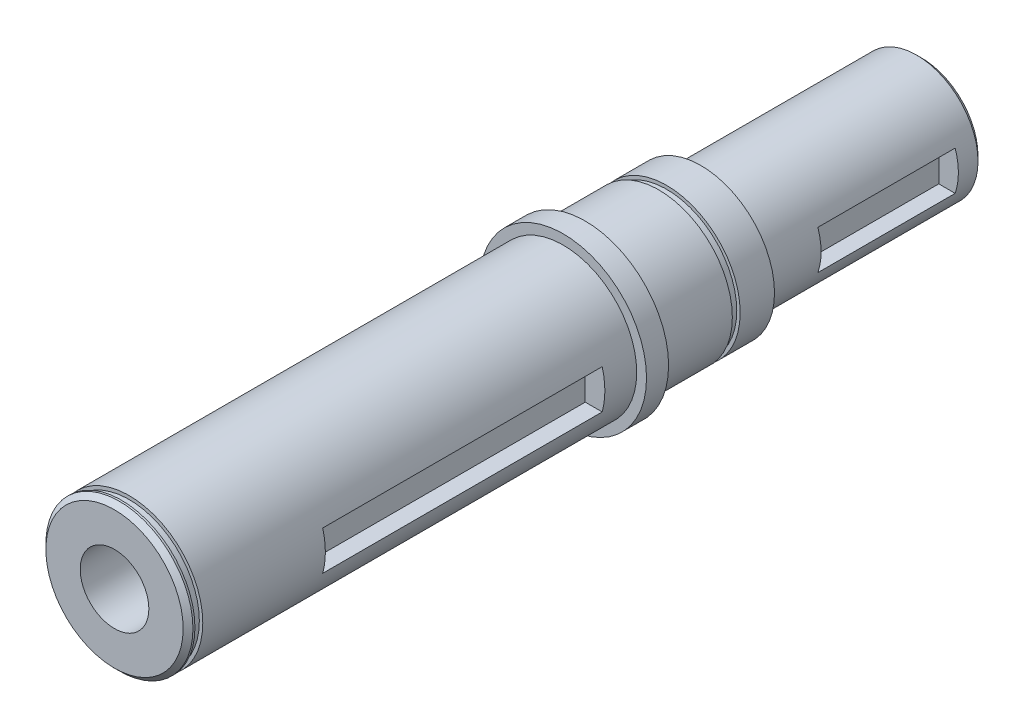
ISO-10303-21;
HEADER;
FILE_DESCRIPTION(('STEP AP214'),'2;1');
FILE_NAME('part.step','',(''),(''),'','','');
FILE_SCHEMA(('AUTOMOTIVE_DESIGN { 1 0 10303 214 1 1 1 1 }'));
ENDSEC;
DATA;
#1=APPLICATION_CONTEXT('core data for automotive mechanical design processes');
#2=APPLICATION_PROTOCOL_DEFINITION('international standard','automotive_design',2000,#1);
#3=PRODUCT_CONTEXT('',#1,'mechanical');
#4=PRODUCT('Part','Part','',(#3));
#5=PRODUCT_RELATED_PRODUCT_CATEGORY('part','',(#4));
#6=PRODUCT_DEFINITION_FORMATION('','',#4);
#7=PRODUCT_DEFINITION_CONTEXT('part definition',#1,'design');
#8=PRODUCT_DEFINITION('design','',#6,#7);
#9=PRODUCT_DEFINITION_SHAPE('','',#8);
#10=(LENGTH_UNIT() NAMED_UNIT(*) SI_UNIT(.MILLI.,.METRE.));
#11=(NAMED_UNIT(*) PLANE_ANGLE_UNIT() SI_UNIT($,.RADIAN.));
#12=(NAMED_UNIT(*) SI_UNIT($,.STERADIAN.) SOLID_ANGLE_UNIT());
#13=UNCERTAINTY_MEASURE_WITH_UNIT(LENGTH_MEASURE(1.E-05),#10,'distance_accuracy_value','');
#14=(GEOMETRIC_REPRESENTATION_CONTEXT(3) GLOBAL_UNCERTAINTY_ASSIGNED_CONTEXT((#13)) GLOBAL_UNIT_ASSIGNED_CONTEXT((#10,
#11,#12)) REPRESENTATION_CONTEXT('',''));
#15=CARTESIAN_POINT('',(0.,0.,0.));
#16=DIRECTION('',(0.,0.,1.));
#17=DIRECTION('',(1.,0.,0.));
#18=AXIS2_PLACEMENT_3D('',#15,#16,#17);
#19=CARTESIAN_POINT('',(0.,0.,-45.));
#20=DIRECTION('',(0.,0.,1.));
#21=DIRECTION('',(1.,0.,0.));
#22=AXIS2_PLACEMENT_3D('',#19,#20,#21);
#23=PLANE('',#22);
#24=CARTESIAN_POINT('',(0.,0.,-45.));
#25=DIRECTION('',(0.,0.,1.));
#26=DIRECTION('',(1.,0.,0.));
#27=AXIS2_PLACEMENT_3D('',#24,#25,#26);
#28=CIRCLE('',#27,7.);
#29=CARTESIAN_POINT('',(7.,0.,-45.));
#30=VERTEX_POINT('',#29);
#31=EDGE_CURVE('E9',#30,#30,#28,.T.);
#32=ORIENTED_EDGE('',*,*,#31,.T.);
#33=EDGE_LOOP('',(#32));
#34=FACE_BOUND('',#33,.T.);
#35=ADVANCED_FACE('F15',(#34),#23,.T.);
#36=CARTESIAN_POINT('',(0.,0.,-45.));
#37=DIRECTION('',(0.,0.,1.));
#38=DIRECTION('',(1.,0.,0.));
#39=AXIS2_PLACEMENT_3D('',#36,#37,#38);
#40=CYLINDRICAL_SURFACE('',#39,7.);
#41=DIRECTION('',(0.,0.,1.));
#42=VECTOR('',#41,1.);
#43=CARTESIAN_POINT('',(7.,0.,-45.));
#44=LINE('',#43,#42);
#45=CARTESIAN_POINT('',(7.,0.,56.5));
#46=VERTEX_POINT('',#45);
#47=EDGE_CURVE('E24',#30,#46,#44,.T.);
#48=ORIENTED_EDGE('',*,*,#47,.F.);
#49=ORIENTED_EDGE('',*,*,#31,.F.);
#50=ORIENTED_EDGE('',*,*,#47,.T.);
#51=CARTESIAN_POINT('',(0.,0.,56.5));
#52=DIRECTION('',(0.,0.,1.));
#53=DIRECTION('',(1.,0.,0.));
#54=AXIS2_PLACEMENT_3D('',#51,#52,#53);
#55=CIRCLE('',#54,7.);
#56=EDGE_CURVE('E356',#46,#46,#55,.T.);
#57=ORIENTED_EDGE('',*,*,#56,.T.);
#58=EDGE_LOOP('',(#48,#49,#50,#57));
#59=FACE_BOUND('',#58,.T.);
#60=ADVANCED_FACE('F414',(#59),#40,.F.);
#61=CARTESIAN_POINT('',(0.,0.,56.5));
#62=DIRECTION('',(0.,0.,1.));
#63=DIRECTION('',(1.,0.,0.));
#64=AXIS2_PLACEMENT_3D('',#61,#62,#63);
#65=PLANE('',#64);
#66=ORIENTED_EDGE('',*,*,#56,.F.);
#67=EDGE_LOOP('',(#66));
#68=FACE_BOUND('',#67,.T.);
#69=CARTESIAN_POINT('',(0.,0.,56.5));
#70=DIRECTION('',(0.,0.,1.));
#71=DIRECTION('',(1.,0.,0.));
#72=AXIS2_PLACEMENT_3D('',#69,#70,#71);
#73=CIRCLE('',#72,14.);
#74=CARTESIAN_POINT('',(14.,0.,56.5));
#75=VERTEX_POINT('',#74);
#76=EDGE_CURVE('E361',#75,#75,#73,.T.);
#77=ORIENTED_EDGE('',*,*,#76,.T.);
#78=EDGE_LOOP('',(#77));
#79=FACE_BOUND('',#78,.T.);
#80=ADVANCED_FACE('F418',(#68,#79),#65,.T.);
#81=CARTESIAN_POINT('',(0.,0.,55.5));
#82=DIRECTION('',(0.,0.,-1.));
#83=DIRECTION('',(1.,0.,0.));
#84=AXIS2_PLACEMENT_3D('',#81,#82,#83);
#85=CONICAL_SURFACE('',#84,15.,0.785398163397);
#86=CARTESIAN_POINT('',(0.,0.,55.5));
#87=DIRECTION('',(0.,0.,1.));
#88=DIRECTION('',(1.,0.,0.));
#89=AXIS2_PLACEMENT_3D('',#86,#87,#88);
#90=CIRCLE('',#89,15.);
#91=CARTESIAN_POINT('',(15.,0.,55.5));
#92=VERTEX_POINT('',#91);
#93=EDGE_CURVE('E314',#92,#92,#90,.T.);
#94=ORIENTED_EDGE('',*,*,#93,.T.);
#95=DIRECTION('',(-0.707106781186548,0.,0.707106781186548));
#96=VECTOR('',#95,1.);
#97=CARTESIAN_POINT('',(15.,0.,55.5));
#98=LINE('',#97,#96);
#99=EDGE_CURVE('E140',#92,#75,#98,.T.);
#100=ORIENTED_EDGE('',*,*,#99,.T.);
#101=ORIENTED_EDGE('',*,*,#76,.F.);
#102=ORIENTED_EDGE('',*,*,#99,.F.);
#103=EDGE_LOOP('',(#94,#100,#101,#102));
#104=FACE_BOUND('',#103,.T.);
#105=ADVANCED_FACE('F420',(#104),#85,.T.);
#106=CARTESIAN_POINT('',(0.,0.,55.1));
#107=DIRECTION('',(0.,0.,1.));
#108=DIRECTION('',(1.,0.,0.));
#109=AXIS2_PLACEMENT_3D('',#106,#107,#108);
#110=CYLINDRICAL_SURFACE('',#109,15.);
#111=CARTESIAN_POINT('',(0.,0.,55.1));
#112=DIRECTION('',(0.,0.,1.));
#113=DIRECTION('',(1.,0.,0.));
#114=AXIS2_PLACEMENT_3D('',#111,#112,#113);
#115=CIRCLE('',#114,15.);
#116=CARTESIAN_POINT('',(15.,0.,55.1));
#117=VERTEX_POINT('',#116);
#118=EDGE_CURVE('E312',#117,#117,#115,.T.);
#119=ORIENTED_EDGE('',*,*,#118,.T.);
#120=DIRECTION('',(0.,0.,1.));
#121=VECTOR('',#120,1.);
#122=CARTESIAN_POINT('',(15.,0.,55.1));
#123=LINE('',#122,#121);
#124=EDGE_CURVE('E128',#117,#92,#123,.T.);
#125=ORIENTED_EDGE('',*,*,#124,.T.);
#126=ORIENTED_EDGE('',*,*,#93,.F.);
#127=ORIENTED_EDGE('',*,*,#124,.F.);
#128=EDGE_LOOP('',(#119,#125,#126,#127));
#129=FACE_BOUND('',#128,.T.);
#130=ADVANCED_FACE('F423',(#129),#110,.T.);
#131=CARTESIAN_POINT('',(0.,0.,55.1));
#132=DIRECTION('',(0.,0.,1.));
#133=DIRECTION('',(1.,0.,0.));
#134=AXIS2_PLACEMENT_3D('',#131,#132,#133);
#135=PLANE('',#134);
#136=ORIENTED_EDGE('',*,*,#118,.F.);
#137=EDGE_LOOP('',(#136));
#138=FACE_BOUND('',#137,.T.);
#139=CARTESIAN_POINT('',(0.,0.,55.1));
#140=DIRECTION('',(0.,0.,1.));
#141=DIRECTION('',(1.,0.,0.));
#142=AXIS2_PLACEMENT_3D('',#139,#140,#141);
#143=CIRCLE('',#142,14.3);
#144=CARTESIAN_POINT('',(14.3,0.,55.1));
#145=VERTEX_POINT('',#144);
#146=EDGE_CURVE('E241',#145,#145,#143,.T.);
#147=ORIENTED_EDGE('',*,*,#146,.T.);
#148=EDGE_LOOP('',(#147));
#149=FACE_BOUND('',#148,.T.);
#150=ADVANCED_FACE('F424',(#138,#149),#135,.F.);
#151=CARTESIAN_POINT('',(0.,0.,53.5));
#152=DIRECTION('',(0.,0.,1.));
#153=DIRECTION('',(1.,0.,0.));
#154=AXIS2_PLACEMENT_3D('',#151,#152,#153);
#155=CYLINDRICAL_SURFACE('',#154,14.3);
#156=CARTESIAN_POINT('',(0.,0.,53.5));
#157=DIRECTION('',(0.,0.,1.));
#158=DIRECTION('',(1.,0.,0.));
#159=AXIS2_PLACEMENT_3D('',#156,#157,#158);
#160=CIRCLE('',#159,14.3);
#161=CARTESIAN_POINT('',(14.3,0.,53.5));
#162=VERTEX_POINT('',#161);
#163=EDGE_CURVE('E331',#162,#162,#160,.T.);
#164=ORIENTED_EDGE('',*,*,#163,.T.);
#165=DIRECTION('',(0.,0.,1.));
#166=VECTOR('',#165,1.);
#167=CARTESIAN_POINT('',(14.3,0.,53.5));
#168=LINE('',#167,#166);
#169=EDGE_CURVE('E236',#162,#145,#168,.T.);
#170=ORIENTED_EDGE('',*,*,#169,.T.);
#171=ORIENTED_EDGE('',*,*,#146,.F.);
#172=ORIENTED_EDGE('',*,*,#169,.F.);
#173=EDGE_LOOP('',(#164,#170,#171,#172));
#174=FACE_BOUND('',#173,.T.);
#175=ADVANCED_FACE('F430',(#174),#155,.T.);
#176=CARTESIAN_POINT('',(11.,-4.,-28.5));
#177=DIRECTION('',(1.,0.,0.));
#178=DIRECTION('',(0.,1.,0.));
#179=AXIS2_PLACEMENT_3D('',#176,#177,#178);
#180=PLANE('',#179);
#181=DIRECTION('',(0.,0.,1.));
#182=VECTOR('',#181,1.);
#183=CARTESIAN_POINT('',(11.,-4.,-28.5));
#184=LINE('',#183,#182);
#185=CARTESIAN_POINT('',(11.,-4.,-28.5));
#186=VERTEX_POINT('',#185);
#187=CARTESIAN_POINT('',(11.,-4.,28.5));
#188=VERTEX_POINT('',#187);
#189=EDGE_CURVE('E245',#186,#188,#184,.T.);
#190=ORIENTED_EDGE('',*,*,#189,.F.);
#191=DIRECTION('',(0.,1.,0.));
#192=VECTOR('',#191,1.);
#193=CARTESIAN_POINT('',(11.,-4.,-28.5));
#194=LINE('',#193,#192);
#195=CARTESIAN_POINT('',(11.,4.,-28.5));
#196=VERTEX_POINT('',#195);
#197=EDGE_CURVE('E365',#186,#196,#194,.T.);
#198=ORIENTED_EDGE('',*,*,#197,.T.);
#199=DIRECTION('',(0.,0.,1.));
#200=VECTOR('',#199,1.);
#201=CARTESIAN_POINT('',(11.,4.,-28.5));
#202=LINE('',#201,#200);
#203=CARTESIAN_POINT('',(11.,4.,28.5));
#204=VERTEX_POINT('',#203);
#205=EDGE_CURVE('E391',#196,#204,#202,.T.);
#206=ORIENTED_EDGE('',*,*,#205,.T.);
#207=DIRECTION('',(0.,1.,0.));
#208=VECTOR('',#207,1.);
#209=CARTESIAN_POINT('',(11.,-4.,28.5));
#210=LINE('',#209,#208);
#211=EDGE_CURVE('E332',#188,#204,#210,.T.);
#212=ORIENTED_EDGE('',*,*,#211,.F.);
#213=EDGE_LOOP('',(#190,#198,#206,#212));
#214=FACE_BOUND('',#213,.T.);
#215=ADVANCED_FACE('F542',(#214),#180,.T.);
#216=CARTESIAN_POINT('',(11.,-4.,-28.5));
#217=DIRECTION('',(0.,1.,0.));
#218=DIRECTION('',(1.,0.,0.));
#219=AXIS2_PLACEMENT_3D('',#216,#217,#218);
#220=PLANE('',#219);
#221=DIRECTION('',(1.,0.,0.));
#222=VECTOR('',#221,1.);
#223=CARTESIAN_POINT('',(11.,-4.,-28.5));
#224=LINE('',#223,#222);
#225=CARTESIAN_POINT('',(14.456832294801,-4.,-28.5));
#226=VERTEX_POINT('',#225);
#227=EDGE_CURVE('E366',#186,#226,#224,.T.);
#228=ORIENTED_EDGE('',*,*,#227,.F.);
#229=ORIENTED_EDGE('',*,*,#189,.T.);
#230=DIRECTION('',(1.,0.,0.));
#231=VECTOR('',#230,1.);
#232=CARTESIAN_POINT('',(11.,-4.,28.5));
#233=LINE('',#232,#231);
#234=CARTESIAN_POINT('',(14.456832294801,-4.,28.5));
#235=VERTEX_POINT('',#234);
#236=EDGE_CURVE('E333',#188,#235,#233,.T.);
#237=ORIENTED_EDGE('',*,*,#236,.T.);
#238=DIRECTION('',(0.,0.,1.));
#239=VECTOR('',#238,1.);
#240=CARTESIAN_POINT('',(14.456832294801,-4.,-35.));
#241=LINE('',#240,#239);
#242=EDGE_CURVE('E349',#226,#235,#241,.T.);
#243=ORIENTED_EDGE('',*,*,#242,.F.);
#244=EDGE_LOOP('',(#228,#229,#237,#243));
#245=FACE_BOUND('',#244,.T.);
#246=ADVANCED_FACE('F440',(#245),#220,.T.);
#247=CARTESIAN_POINT('',(0.,0.,53.5));
#248=DIRECTION('',(0.,0.,1.));
#249=DIRECTION('',(1.,0.,0.));
#250=AXIS2_PLACEMENT_3D('',#247,#248,#249);
#251=PLANE('',#250);
#252=ORIENTED_EDGE('',*,*,#163,.F.);
#253=EDGE_LOOP('',(#252));
#254=FACE_BOUND('',#253,.T.);
#255=CARTESIAN_POINT('',(0.,0.,53.5));
#256=DIRECTION('',(0.,0.,1.));
#257=DIRECTION('',(1.,0.,0.));
#258=AXIS2_PLACEMENT_3D('',#255,#256,#257);
#259=CIRCLE('',#258,15.);
#260=CARTESIAN_POINT('',(15.,0.,53.5));
#261=VERTEX_POINT('',#260);
#262=EDGE_CURVE('E296',#261,#261,#259,.T.);
#263=ORIENTED_EDGE('',*,*,#262,.T.);
#264=EDGE_LOOP('',(#263));
#265=FACE_BOUND('',#264,.T.);
#266=ADVANCED_FACE('F433',(#254,#265),#251,.T.);
#267=CARTESIAN_POINT('',(11.,-4.,28.5));
#268=DIRECTION('',(0.,0.,1.));
#269=DIRECTION('',(1.,0.,0.));
#270=AXIS2_PLACEMENT_3D('',#267,#268,#269);
#271=PLANE('',#270);
#272=CARTESIAN_POINT('',(0.,0.,28.5));
#273=DIRECTION('',(0.,0.,1.));
#274=DIRECTION('',(1.,0.,0.));
#275=AXIS2_PLACEMENT_3D('',#272,#273,#274);
#276=CIRCLE('',#275,15.);
#277=CARTESIAN_POINT('',(15.,0.,28.5));
#278=VERTEX_POINT('',#277);
#279=CARTESIAN_POINT('',(14.456832294801,4.,28.5));
#280=VERTEX_POINT('',#279);
#281=EDGE_CURVE('E295',#278,#280,#276,.T.);
#282=ORIENTED_EDGE('',*,*,#281,.F.);
#283=CARTESIAN_POINT('',(0.,0.,28.5));
#284=DIRECTION('',(0.,0.,1.));
#285=DIRECTION('',(1.,0.,0.));
#286=AXIS2_PLACEMENT_3D('',#283,#284,#285);
#287=CIRCLE('',#286,15.);
#288=EDGE_CURVE('E353',#235,#278,#287,.T.);
#289=ORIENTED_EDGE('',*,*,#288,.F.);
#290=ORIENTED_EDGE('',*,*,#236,.F.);
#291=ORIENTED_EDGE('',*,*,#211,.T.);
#292=DIRECTION('',(1.,0.,0.));
#293=VECTOR('',#292,1.);
#294=CARTESIAN_POINT('',(11.,4.,28.5));
#295=LINE('',#294,#293);
#296=EDGE_CURVE('E387',#204,#280,#295,.T.);
#297=ORIENTED_EDGE('',*,*,#296,.T.);
#298=EDGE_LOOP('',(#282,#289,#290,#291,#297));
#299=FACE_BOUND('',#298,.T.);
#300=ADVANCED_FACE('F436',(#299),#271,.F.);
#301=CARTESIAN_POINT('',(11.,4.,-28.5));
#302=DIRECTION('',(0.,1.,0.));
#303=DIRECTION('',(1.,0.,0.));
#304=AXIS2_PLACEMENT_3D('',#301,#302,#303);
#305=PLANE('',#304);
#306=DIRECTION('',(0.,0.,1.));
#307=VECTOR('',#306,1.);
#308=CARTESIAN_POINT('',(14.456832294801,4.,-35.));
#309=LINE('',#308,#307);
#310=CARTESIAN_POINT('',(14.456832294801,4.,-28.5));
#311=VERTEX_POINT('',#310);
#312=EDGE_CURVE('E294',#311,#280,#309,.T.);
#313=ORIENTED_EDGE('',*,*,#312,.T.);
#314=ORIENTED_EDGE('',*,*,#296,.F.);
#315=ORIENTED_EDGE('',*,*,#205,.F.);
#316=DIRECTION('',(1.,0.,0.));
#317=VECTOR('',#316,1.);
#318=CARTESIAN_POINT('',(11.,4.,-28.5));
#319=LINE('',#318,#317);
#320=EDGE_CURVE('E369',#196,#311,#319,.T.);
#321=ORIENTED_EDGE('',*,*,#320,.T.);
#322=EDGE_LOOP('',(#313,#314,#315,#321));
#323=FACE_BOUND('',#322,.T.);
#324=ADVANCED_FACE('F451',(#323),#305,.F.);
#325=CARTESIAN_POINT('',(11.,-4.,-28.5));
#326=DIRECTION('',(0.,0.,1.));
#327=DIRECTION('',(1.,0.,0.));
#328=AXIS2_PLACEMENT_3D('',#325,#326,#327);
#329=PLANE('',#328);
#330=ORIENTED_EDGE('',*,*,#320,.F.);
#331=ORIENTED_EDGE('',*,*,#197,.F.);
#332=ORIENTED_EDGE('',*,*,#227,.T.);
#333=CARTESIAN_POINT('',(0.,0.,-28.5));
#334=DIRECTION('',(0.,0.,1.));
#335=DIRECTION('',(1.,0.,0.));
#336=AXIS2_PLACEMENT_3D('',#333,#334,#335);
#337=CIRCLE('',#336,15.);
#338=CARTESIAN_POINT('',(15.,0.,-28.5));
#339=VERTEX_POINT('',#338);
#340=EDGE_CURVE('E350',#226,#339,#337,.T.);
#341=ORIENTED_EDGE('',*,*,#340,.T.);
#342=CARTESIAN_POINT('',(0.,0.,-28.5));
#343=DIRECTION('',(0.,0.,1.));
#344=DIRECTION('',(1.,0.,0.));
#345=AXIS2_PLACEMENT_3D('',#342,#343,#344);
#346=CIRCLE('',#345,15.);
#347=EDGE_CURVE('E378',#339,#311,#346,.T.);
#348=ORIENTED_EDGE('',*,*,#347,.T.);
#349=EDGE_LOOP('',(#330,#331,#332,#341,#348));
#350=FACE_BOUND('',#349,.T.);
#351=ADVANCED_FACE('F454',(#350),#329,.T.);
#352=CARTESIAN_POINT('',(0.,0.,-35.));
#353=DIRECTION('',(0.,0.,1.));
#354=DIRECTION('',(1.,0.,0.));
#355=AXIS2_PLACEMENT_3D('',#352,#353,#354);
#356=CYLINDRICAL_SURFACE('',#355,15.);
#357=DIRECTION('',(0.,0.,1.));
#358=VECTOR('',#357,1.);
#359=CARTESIAN_POINT('',(15.,0.,-35.));
#360=LINE('',#359,#358);
#361=CARTESIAN_POINT('',(15.,0.,-35.));
#362=VERTEX_POINT('',#361);
#363=EDGE_CURVE('E345',#362,#339,#360,.T.);
#364=ORIENTED_EDGE('',*,*,#363,.F.);
#365=CARTESIAN_POINT('',(0.,0.,-35.));
#366=DIRECTION('',(0.,0.,1.));
#367=DIRECTION('',(1.,0.,0.));
#368=AXIS2_PLACEMENT_3D('',#365,#366,#367);
#369=CIRCLE('',#368,15.);
#370=EDGE_CURVE('E339',#362,#362,#369,.T.);
#371=ORIENTED_EDGE('',*,*,#370,.T.);
#372=ORIENTED_EDGE('',*,*,#363,.T.);
#373=ORIENTED_EDGE('',*,*,#340,.F.);
#374=ORIENTED_EDGE('',*,*,#242,.T.);
#375=ORIENTED_EDGE('',*,*,#288,.T.);
#376=DIRECTION('',(0.,0.,1.));
#377=VECTOR('',#376,1.);
#378=CARTESIAN_POINT('',(15.,0.,-35.));
#379=LINE('',#378,#377);
#380=EDGE_CURVE('E359',#278,#261,#379,.T.);
#381=ORIENTED_EDGE('',*,*,#380,.T.);
#382=ORIENTED_EDGE('',*,*,#262,.F.);
#383=ORIENTED_EDGE('',*,*,#380,.F.);
#384=ORIENTED_EDGE('',*,*,#281,.T.);
#385=ORIENTED_EDGE('',*,*,#312,.F.);
#386=ORIENTED_EDGE('',*,*,#347,.F.);
#387=EDGE_LOOP('',(#364,#371,#372,#373,#374,#375,#381,#382,#383,#384,#385,#386));
#388=FACE_BOUND('',#387,.T.);
#389=ADVANCED_FACE('F445',(#388),#356,.T.);
#390=CARTESIAN_POINT('',(0.,0.,-35.));
#391=DIRECTION('',(0.,0.,1.));
#392=DIRECTION('',(1.,0.,0.));
#393=AXIS2_PLACEMENT_3D('',#390,#391,#392);
#394=PLANE('',#393);
#395=ORIENTED_EDGE('',*,*,#370,.F.);
#396=EDGE_LOOP('',(#395));
#397=FACE_BOUND('',#396,.T.);
#398=CARTESIAN_POINT('',(0.,0.,-35.));
#399=DIRECTION('',(0.,0.,1.));
#400=DIRECTION('',(1.,0.,0.));
#401=AXIS2_PLACEMENT_3D('',#398,#399,#400);
#402=CIRCLE('',#401,17.);
#403=CARTESIAN_POINT('',(17.,0.,-35.));
#404=VERTEX_POINT('',#403);
#405=EDGE_CURVE('E329',#404,#404,#402,.T.);
#406=ORIENTED_EDGE('',*,*,#405,.T.);
#407=EDGE_LOOP('',(#406));
#408=FACE_BOUND('',#407,.T.);
#409=ADVANCED_FACE('F457',(#397,#408),#394,.T.);
#410=CARTESIAN_POINT('',(0.,0.,-39.5));
#411=DIRECTION('',(0.,0.,1.));
#412=DIRECTION('',(1.,0.,0.));
#413=AXIS2_PLACEMENT_3D('',#410,#411,#412);
#414=CYLINDRICAL_SURFACE('',#413,17.);
#415=CARTESIAN_POINT('',(0.,0.,-39.5));
#416=DIRECTION('',(0.,0.,1.));
#417=DIRECTION('',(1.,0.,0.));
#418=AXIS2_PLACEMENT_3D('',#415,#416,#417);
#419=CIRCLE('',#418,17.);
#420=CARTESIAN_POINT('',(17.,0.,-39.5));
#421=VERTEX_POINT('',#420);
#422=EDGE_CURVE('E325',#421,#421,#419,.T.);
#423=ORIENTED_EDGE('',*,*,#422,.T.);
#424=DIRECTION('',(0.,0.,1.));
#425=VECTOR('',#424,1.);
#426=CARTESIAN_POINT('',(17.,0.,-39.5));
#427=LINE('',#426,#425);
#428=EDGE_CURVE('E326',#421,#404,#427,.T.);
#429=ORIENTED_EDGE('',*,*,#428,.T.);
#430=ORIENTED_EDGE('',*,*,#405,.F.);
#431=ORIENTED_EDGE('',*,*,#428,.F.);
#432=EDGE_LOOP('',(#423,#429,#430,#431));
#433=FACE_BOUND('',#432,.T.);
#434=ADVANCED_FACE('F465',(#433),#414,.T.);
#435=CARTESIAN_POINT('',(0.,0.,-39.5));
#436=DIRECTION('',(0.,0.,1.));
#437=DIRECTION('',(1.,0.,0.));
#438=AXIS2_PLACEMENT_3D('',#435,#436,#437);
#439=PLANE('',#438);
#440=ORIENTED_EDGE('',*,*,#422,.F.);
#441=EDGE_LOOP('',(#440));
#442=FACE_BOUND('',#441,.T.);
#443=CARTESIAN_POINT('',(0.,0.,-39.5));
#444=DIRECTION('',(0.,0.,1.));
#445=DIRECTION('',(1.,0.,0.));
#446=AXIS2_PLACEMENT_3D('',#443,#444,#445);
#447=CIRCLE('',#446,15.);
#448=CARTESIAN_POINT('',(15.,0.,-39.5));
#449=VERTEX_POINT('',#448);
#450=EDGE_CURVE('E317',#449,#449,#447,.T.);
#451=ORIENTED_EDGE('',*,*,#450,.T.);
#452=EDGE_LOOP('',(#451));
#453=FACE_BOUND('',#452,.T.);
#454=ADVANCED_FACE('F469',(#442,#453),#439,.F.);
#455=CARTESIAN_POINT('',(0.,0.,-54.5));
#456=DIRECTION('',(0.,0.,1.));
#457=DIRECTION('',(1.,0.,0.));
#458=AXIS2_PLACEMENT_3D('',#455,#456,#457);
#459=CYLINDRICAL_SURFACE('',#458,15.);
#460=CARTESIAN_POINT('',(0.,0.,-54.5));
#461=DIRECTION('',(0.,0.,1.));
#462=DIRECTION('',(1.,0.,0.));
#463=AXIS2_PLACEMENT_3D('',#460,#461,#462);
#464=CIRCLE('',#463,15.);
#465=CARTESIAN_POINT('',(15.,0.,-54.5));
#466=VERTEX_POINT('',#465);
#467=EDGE_CURVE('E307',#466,#466,#464,.T.);
#468=ORIENTED_EDGE('',*,*,#467,.T.);
#469=DIRECTION('',(0.,0.,1.));
#470=VECTOR('',#469,1.);
#471=CARTESIAN_POINT('',(15.,0.,-54.5));
#472=LINE('',#471,#470);
#473=EDGE_CURVE('E313',#466,#449,#472,.T.);
#474=ORIENTED_EDGE('',*,*,#473,.T.);
#475=ORIENTED_EDGE('',*,*,#450,.F.);
#476=ORIENTED_EDGE('',*,*,#473,.F.);
#477=EDGE_LOOP('',(#468,#474,#475,#476));
#478=FACE_BOUND('',#477,.T.);
#479=ADVANCED_FACE('F473',(#478),#459,.T.);
#480=CARTESIAN_POINT('',(0.,0.,-54.5));
#481=DIRECTION('',(0.,0.,1.));
#482=DIRECTION('',(1.,0.,0.));
#483=AXIS2_PLACEMENT_3D('',#480,#481,#482);
#484=PLANE('',#483);
#485=ORIENTED_EDGE('',*,*,#467,.F.);
#486=EDGE_LOOP('',(#485));
#487=FACE_BOUND('',#486,.T.);
#488=CARTESIAN_POINT('',(0.,0.,-54.5));
#489=DIRECTION('',(0.,0.,1.));
#490=DIRECTION('',(1.,0.,0.));
#491=AXIS2_PLACEMENT_3D('',#488,#489,#490);
#492=CIRCLE('',#491,14.3);
#493=CARTESIAN_POINT('',(14.3,0.,-54.5));
#494=VERTEX_POINT('',#493);
#495=EDGE_CURVE('E301',#494,#494,#492,.T.);
#496=ORIENTED_EDGE('',*,*,#495,.T.);
#497=EDGE_LOOP('',(#496));
#498=FACE_BOUND('',#497,.T.);
#499=ADVANCED_FACE('F480',(#487,#498),#484,.F.);
#500=CARTESIAN_POINT('',(0.,0.,-56.1));
#501=DIRECTION('',(0.,0.,1.));
#502=DIRECTION('',(1.,0.,0.));
#503=AXIS2_PLACEMENT_3D('',#500,#501,#502);
#504=CYLINDRICAL_SURFACE('',#503,14.3);
#505=CARTESIAN_POINT('',(0.,0.,-56.1));
#506=DIRECTION('',(0.,0.,1.));
#507=DIRECTION('',(1.,0.,0.));
#508=AXIS2_PLACEMENT_3D('',#505,#506,#507);
#509=CIRCLE('',#508,14.3);
#510=CARTESIAN_POINT('',(14.3,0.,-56.1));
#511=VERTEX_POINT('',#510);
#512=EDGE_CURVE('E298',#511,#511,#509,.T.);
#513=ORIENTED_EDGE('',*,*,#512,.T.);
#514=DIRECTION('',(0.,0.,1.));
#515=VECTOR('',#514,1.);
#516=CARTESIAN_POINT('',(14.3,0.,-56.1));
#517=LINE('',#516,#515);
#518=EDGE_CURVE('E304',#511,#494,#517,.T.);
#519=ORIENTED_EDGE('',*,*,#518,.T.);
#520=ORIENTED_EDGE('',*,*,#495,.F.);
#521=ORIENTED_EDGE('',*,*,#518,.F.);
#522=EDGE_LOOP('',(#513,#519,#520,#521));
#523=FACE_BOUND('',#522,.T.);
#524=ADVANCED_FACE('F477',(#523),#504,.T.);
#525=CARTESIAN_POINT('',(0.,0.,-56.1));
#526=DIRECTION('',(0.,0.,1.));
#527=DIRECTION('',(1.,0.,0.));
#528=AXIS2_PLACEMENT_3D('',#525,#526,#527);
#529=PLANE('',#528);
#530=ORIENTED_EDGE('',*,*,#512,.F.);
#531=EDGE_LOOP('',(#530));
#532=FACE_BOUND('',#531,.T.);
#533=CARTESIAN_POINT('',(0.,0.,-56.1));
#534=DIRECTION('',(0.,0.,1.));
#535=DIRECTION('',(1.,0.,0.));
#536=AXIS2_PLACEMENT_3D('',#533,#534,#535);
#537=CIRCLE('',#536,15.);
#538=CARTESIAN_POINT('',(15.,0.,-56.1));
#539=VERTEX_POINT('',#538);
#540=EDGE_CURVE('E289',#539,#539,#537,.T.);
#541=ORIENTED_EDGE('',*,*,#540,.T.);
#542=EDGE_LOOP('',(#541));
#543=FACE_BOUND('',#542,.T.);
#544=ADVANCED_FACE('F530',(#532,#543),#529,.T.);
#545=CARTESIAN_POINT('',(0.,0.,-63.1));
#546=DIRECTION('',(0.,0.,1.));
#547=DIRECTION('',(1.,0.,0.));
#548=AXIS2_PLACEMENT_3D('',#545,#546,#547);
#549=CYLINDRICAL_SURFACE('',#548,15.);
#550=CARTESIAN_POINT('',(0.,0.,-63.1));
#551=DIRECTION('',(0.,0.,1.));
#552=DIRECTION('',(1.,0.,0.));
#553=AXIS2_PLACEMENT_3D('',#550,#551,#552);
#554=CIRCLE('',#553,15.);
#555=CARTESIAN_POINT('',(15.,0.,-63.1));
#556=VERTEX_POINT('',#555);
#557=EDGE_CURVE('E276',#556,#556,#554,.T.);
#558=ORIENTED_EDGE('',*,*,#557,.T.);
#559=DIRECTION('',(0.,0.,1.));
#560=VECTOR('',#559,1.);
#561=CARTESIAN_POINT('',(15.,0.,-63.1));
#562=LINE('',#561,#560);
#563=EDGE_CURVE('E286',#556,#539,#562,.T.);
#564=ORIENTED_EDGE('',*,*,#563,.T.);
#565=ORIENTED_EDGE('',*,*,#540,.F.);
#566=ORIENTED_EDGE('',*,*,#563,.F.);
#567=EDGE_LOOP('',(#558,#564,#565,#566));
#568=FACE_BOUND('',#567,.T.);
#569=ADVANCED_FACE('F519',(#568),#549,.T.);
#570=CARTESIAN_POINT('',(8.5,-4.,-103.1));
#571=DIRECTION('',(1.,0.,0.));
#572=DIRECTION('',(0.,1.,0.));
#573=AXIS2_PLACEMENT_3D('',#570,#571,#572);
#574=PLANE('',#573);
#575=DIRECTION('',(0.,0.,1.));
#576=VECTOR('',#575,1.);
#577=CARTESIAN_POINT('',(8.5,-4.,-103.1));
#578=LINE('',#577,#576);
#579=CARTESIAN_POINT('',(8.5,-4.,-103.1));
#580=VERTEX_POINT('',#579);
#581=CARTESIAN_POINT('',(8.5,-4.,-75.1));
#582=VERTEX_POINT('',#581);
#583=EDGE_CURVE('E284',#580,#582,#578,.T.);
#584=ORIENTED_EDGE('',*,*,#583,.F.);
#585=DIRECTION('',(0.,1.,0.));
#586=VECTOR('',#585,1.);
#587=CARTESIAN_POINT('',(8.5,-4.,-103.1));
#588=LINE('',#587,#586);
#589=CARTESIAN_POINT('',(8.5,4.,-103.1));
#590=VERTEX_POINT('',#589);
#591=EDGE_CURVE('E235',#580,#590,#588,.T.);
#592=ORIENTED_EDGE('',*,*,#591,.T.);
#593=DIRECTION('',(0.,0.,1.));
#594=VECTOR('',#593,1.);
#595=CARTESIAN_POINT('',(8.5,4.,-103.1));
#596=LINE('',#595,#594);
#597=CARTESIAN_POINT('',(8.5,4.,-75.1));
#598=VERTEX_POINT('',#597);
#599=EDGE_CURVE('E226',#590,#598,#596,.T.);
#600=ORIENTED_EDGE('',*,*,#599,.T.);
#601=DIRECTION('',(0.,1.,0.));
#602=VECTOR('',#601,1.);
#603=CARTESIAN_POINT('',(8.5,-4.,-75.1));
#604=LINE('',#603,#602);
#605=EDGE_CURVE('E274',#582,#598,#604,.T.);
#606=ORIENTED_EDGE('',*,*,#605,.F.);
#607=EDGE_LOOP('',(#584,#592,#600,#606));
#608=FACE_BOUND('',#607,.T.);
#609=ADVANCED_FACE('F520',(#608),#574,.T.);
#610=CARTESIAN_POINT('',(8.5,-4.,-103.1));
#611=DIRECTION('',(0.,1.,0.));
#612=DIRECTION('',(1.,0.,0.));
#613=AXIS2_PLACEMENT_3D('',#610,#611,#612);
#614=PLANE('',#613);
#615=DIRECTION('',(1.,0.,0.));
#616=VECTOR('',#615,1.);
#617=CARTESIAN_POINT('',(8.5,-4.,-103.1));
#618=LINE('',#617,#616);
#619=CARTESIAN_POINT('',(11.842719282327,-4.,-103.1));
#620=VERTEX_POINT('',#619);
#621=EDGE_CURVE('E227',#580,#620,#618,.T.);
#622=ORIENTED_EDGE('',*,*,#621,.F.);
#623=ORIENTED_EDGE('',*,*,#583,.T.);
#624=DIRECTION('',(1.,0.,0.));
#625=VECTOR('',#624,1.);
#626=CARTESIAN_POINT('',(8.5,-4.,-75.1));
#627=LINE('',#626,#625);
#628=CARTESIAN_POINT('',(11.842719282327,-4.,-75.1));
#629=VERTEX_POINT('',#628);
#630=EDGE_CURVE('E275',#582,#629,#627,.T.);
#631=ORIENTED_EDGE('',*,*,#630,.T.);
#632=DIRECTION('',(0.,0.,1.));
#633=VECTOR('',#632,1.);
#634=CARTESIAN_POINT('',(11.842719282327,-4.,-107.1));
#635=LINE('',#634,#633);
#636=EDGE_CURVE('E247',#620,#629,#635,.T.);
#637=ORIENTED_EDGE('',*,*,#636,.F.);
#638=EDGE_LOOP('',(#622,#623,#631,#637));
#639=FACE_BOUND('',#638,.T.);
#640=ADVANCED_FACE('F514',(#639),#614,.T.);
#641=CARTESIAN_POINT('',(0.,0.,-63.1));
#642=DIRECTION('',(0.,0.,1.));
#643=DIRECTION('',(1.,0.,0.));
#644=AXIS2_PLACEMENT_3D('',#641,#642,#643);
#645=PLANE('',#644);
#646=ORIENTED_EDGE('',*,*,#557,.F.);
#647=EDGE_LOOP('',(#646));
#648=FACE_BOUND('',#647,.T.);
#649=CARTESIAN_POINT('',(0.,0.,-63.1));
#650=DIRECTION('',(0.,0.,1.));
#651=DIRECTION('',(1.,0.,0.));
#652=AXIS2_PLACEMENT_3D('',#649,#650,#651);
#653=CIRCLE('',#652,12.5);
#654=CARTESIAN_POINT('',(12.5,0.,-63.1));
#655=VERTEX_POINT('',#654);
#656=EDGE_CURVE('E218',#655,#655,#653,.T.);
#657=ORIENTED_EDGE('',*,*,#656,.T.);
#658=EDGE_LOOP('',(#657));
#659=FACE_BOUND('',#658,.T.);
#660=ADVANCED_FACE('F527',(#648,#659),#645,.F.);
#661=CARTESIAN_POINT('',(8.5,-4.,-75.1));
#662=DIRECTION('',(0.,0.,1.));
#663=DIRECTION('',(1.,0.,0.));
#664=AXIS2_PLACEMENT_3D('',#661,#662,#663);
#665=PLANE('',#664);
#666=CARTESIAN_POINT('',(0.,0.,-75.1));
#667=DIRECTION('',(0.,0.,1.));
#668=DIRECTION('',(1.,0.,0.));
#669=AXIS2_PLACEMENT_3D('',#666,#667,#668);
#670=CIRCLE('',#669,12.5);
#671=CARTESIAN_POINT('',(12.5,0.,-75.1));
#672=VERTEX_POINT('',#671);
#673=CARTESIAN_POINT('',(11.842719282327,4.,-75.1));
#674=VERTEX_POINT('',#673);
#675=EDGE_CURVE('E220',#672,#674,#670,.T.);
#676=ORIENTED_EDGE('',*,*,#675,.F.);
#677=CARTESIAN_POINT('',(0.,0.,-75.1));
#678=DIRECTION('',(0.,0.,1.));
#679=DIRECTION('',(1.,0.,0.));
#680=AXIS2_PLACEMENT_3D('',#677,#678,#679);
#681=CIRCLE('',#680,12.5);
#682=EDGE_CURVE('E248',#629,#672,#681,.T.);
#683=ORIENTED_EDGE('',*,*,#682,.F.);
#684=ORIENTED_EDGE('',*,*,#630,.F.);
#685=ORIENTED_EDGE('',*,*,#605,.T.);
#686=DIRECTION('',(1.,0.,0.));
#687=VECTOR('',#686,1.);
#688=CARTESIAN_POINT('',(8.5,4.,-75.1));
#689=LINE('',#688,#687);
#690=EDGE_CURVE('E224',#598,#674,#689,.T.);
#691=ORIENTED_EDGE('',*,*,#690,.T.);
#692=EDGE_LOOP('',(#676,#683,#684,#685,#691));
#693=FACE_BOUND('',#692,.T.);
#694=ADVANCED_FACE('F501',(#693),#665,.F.);
#695=CARTESIAN_POINT('',(8.5,4.,-103.1));
#696=DIRECTION('',(0.,1.,0.));
#697=DIRECTION('',(1.,0.,0.));
#698=AXIS2_PLACEMENT_3D('',#695,#696,#697);
#699=PLANE('',#698);
#700=DIRECTION('',(0.,0.,1.));
#701=VECTOR('',#700,1.);
#702=CARTESIAN_POINT('',(11.842719282327,4.,-107.1));
#703=LINE('',#702,#701);
#704=CARTESIAN_POINT('',(11.842719282327,4.,-103.1));
#705=VERTEX_POINT('',#704);
#706=EDGE_CURVE('E260',#705,#674,#703,.T.);
#707=ORIENTED_EDGE('',*,*,#706,.T.);
#708=ORIENTED_EDGE('',*,*,#690,.F.);
#709=ORIENTED_EDGE('',*,*,#599,.F.);
#710=DIRECTION('',(1.,0.,0.));
#711=VECTOR('',#710,1.);
#712=CARTESIAN_POINT('',(8.5,4.,-103.1));
#713=LINE('',#712,#711);
#714=EDGE_CURVE('E240',#590,#705,#713,.T.);
#715=ORIENTED_EDGE('',*,*,#714,.T.);
#716=EDGE_LOOP('',(#707,#708,#709,#715));
#717=FACE_BOUND('',#716,.T.);
#718=ADVANCED_FACE('F506',(#717),#699,.F.);
#719=CARTESIAN_POINT('',(8.5,-4.,-103.1));
#720=DIRECTION('',(0.,0.,1.));
#721=DIRECTION('',(1.,0.,0.));
#722=AXIS2_PLACEMENT_3D('',#719,#720,#721);
#723=PLANE('',#722);
#724=ORIENTED_EDGE('',*,*,#714,.F.);
#725=ORIENTED_EDGE('',*,*,#591,.F.);
#726=ORIENTED_EDGE('',*,*,#621,.T.);
#727=CARTESIAN_POINT('',(0.,0.,-103.1));
#728=DIRECTION('',(0.,0.,1.));
#729=DIRECTION('',(1.,0.,0.));
#730=AXIS2_PLACEMENT_3D('',#727,#728,#729);
#731=CIRCLE('',#730,12.5);
#732=CARTESIAN_POINT('',(12.5,0.,-103.1));
#733=VERTEX_POINT('',#732);
#734=EDGE_CURVE('E231',#620,#733,#731,.T.);
#735=ORIENTED_EDGE('',*,*,#734,.T.);
#736=CARTESIAN_POINT('',(0.,0.,-103.1));
#737=DIRECTION('',(0.,0.,1.));
#738=DIRECTION('',(1.,0.,0.));
#739=AXIS2_PLACEMENT_3D('',#736,#737,#738);
#740=CIRCLE('',#739,12.5);
#741=EDGE_CURVE('E261',#733,#705,#740,.T.);
#742=ORIENTED_EDGE('',*,*,#741,.T.);
#743=EDGE_LOOP('',(#724,#725,#726,#735,#742));
#744=FACE_BOUND('',#743,.T.);
#745=ADVANCED_FACE('F509',(#744),#723,.T.);
#746=CARTESIAN_POINT('',(0.,0.,-107.1));
#747=DIRECTION('',(0.,0.,1.));
#748=DIRECTION('',(1.,0.,0.));
#749=AXIS2_PLACEMENT_3D('',#746,#747,#748);
#750=CYLINDRICAL_SURFACE('',#749,12.5);
#751=DIRECTION('',(0.,0.,1.));
#752=VECTOR('',#751,1.);
#753=CARTESIAN_POINT('',(12.5,0.,-107.1));
#754=LINE('',#753,#752);
#755=CARTESIAN_POINT('',(12.5,0.,-107.1));
#756=VERTEX_POINT('',#755);
#757=EDGE_CURVE('E215',#756,#733,#754,.T.);
#758=ORIENTED_EDGE('',*,*,#757,.F.);
#759=CARTESIAN_POINT('',(0.,0.,-107.1));
#760=DIRECTION('',(0.,0.,1.));
#761=DIRECTION('',(1.,0.,0.));
#762=AXIS2_PLACEMENT_3D('',#759,#760,#761);
#763=CIRCLE('',#762,12.5);
#764=EDGE_CURVE('E206',#756,#756,#763,.T.);
#765=ORIENTED_EDGE('',*,*,#764,.T.);
#766=ORIENTED_EDGE('',*,*,#757,.T.);
#767=ORIENTED_EDGE('',*,*,#734,.F.);
#768=ORIENTED_EDGE('',*,*,#636,.T.);
#769=ORIENTED_EDGE('',*,*,#682,.T.);
#770=DIRECTION('',(0.,0.,1.));
#771=VECTOR('',#770,1.);
#772=CARTESIAN_POINT('',(12.5,0.,-107.1));
#773=LINE('',#772,#771);
#774=EDGE_CURVE('E225',#672,#655,#773,.T.);
#775=ORIENTED_EDGE('',*,*,#774,.T.);
#776=ORIENTED_EDGE('',*,*,#656,.F.);
#777=ORIENTED_EDGE('',*,*,#774,.F.);
#778=ORIENTED_EDGE('',*,*,#675,.T.);
#779=ORIENTED_EDGE('',*,*,#706,.F.);
#780=ORIENTED_EDGE('',*,*,#741,.F.);
#781=EDGE_LOOP('',(#758,#765,#766,#767,#768,#769,#775,#776,#777,#778,#779,#780));
#782=FACE_BOUND('',#781,.T.);
#783=ADVANCED_FACE('F500',(#782),#750,.T.);
#784=CARTESIAN_POINT('',(0.,0.,-108.1));
#785=DIRECTION('',(0.,0.,1.));
#786=DIRECTION('',(1.,0.,0.));
#787=AXIS2_PLACEMENT_3D('',#784,#785,#786);
#788=CONICAL_SURFACE('',#787,11.5,0.785398163397);
#789=CARTESIAN_POINT('',(0.,0.,-108.1));
#790=DIRECTION('',(0.,0.,1.));
#791=DIRECTION('',(1.,0.,0.));
#792=AXIS2_PLACEMENT_3D('',#789,#790,#791);
#793=CIRCLE('',#792,11.5);
#794=CARTESIAN_POINT('',(11.5,0.,-108.1));
#795=VERTEX_POINT('',#794);
#796=EDGE_CURVE('E204',#795,#795,#793,.T.);
#797=ORIENTED_EDGE('',*,*,#796,.T.);
#798=DIRECTION('',(0.707106781186548,0.,0.707106781186548));
#799=VECTOR('',#798,1.);
#800=CARTESIAN_POINT('',(11.5,0.,-108.1));
#801=LINE('',#800,#799);
#802=EDGE_CURVE('E203',#795,#756,#801,.T.);
#803=ORIENTED_EDGE('',*,*,#802,.T.);
#804=ORIENTED_EDGE('',*,*,#764,.F.);
#805=ORIENTED_EDGE('',*,*,#802,.F.);
#806=EDGE_LOOP('',(#797,#803,#804,#805));
#807=FACE_BOUND('',#806,.T.);
#808=ADVANCED_FACE('F205',(#807),#788,.T.);
#809=CARTESIAN_POINT('',(0.,0.,-108.1));
#810=DIRECTION('',(0.,0.,1.));
#811=DIRECTION('',(1.,0.,0.));
#812=AXIS2_PLACEMENT_3D('',#809,#810,#811);
#813=PLANE('',#812);
#814=ORIENTED_EDGE('',*,*,#796,.F.);
#815=EDGE_LOOP('',(#814));
#816=FACE_BOUND('',#815,.T.);
#817=ADVANCED_FACE('F575',(#816),#813,.F.);
#818=CLOSED_SHELL('',(#35,#60,#80,#105,#130,#150,#175,#215,#246,#266,#300,#324,#351,#389,#409,
#434,#454,#479,#499,#524,#544,#569,#609,#640,#660,#694,#718,#745,#783,#808,#817));
#819=MANIFOLD_SOLID_BREP('B1',#818);
#820=ADVANCED_BREP_SHAPE_REPRESENTATION('',(#18,#819),#14);
#821=SHAPE_DEFINITION_REPRESENTATION(#9,#820);
ENDSEC;
END-ISO-10303-21;
